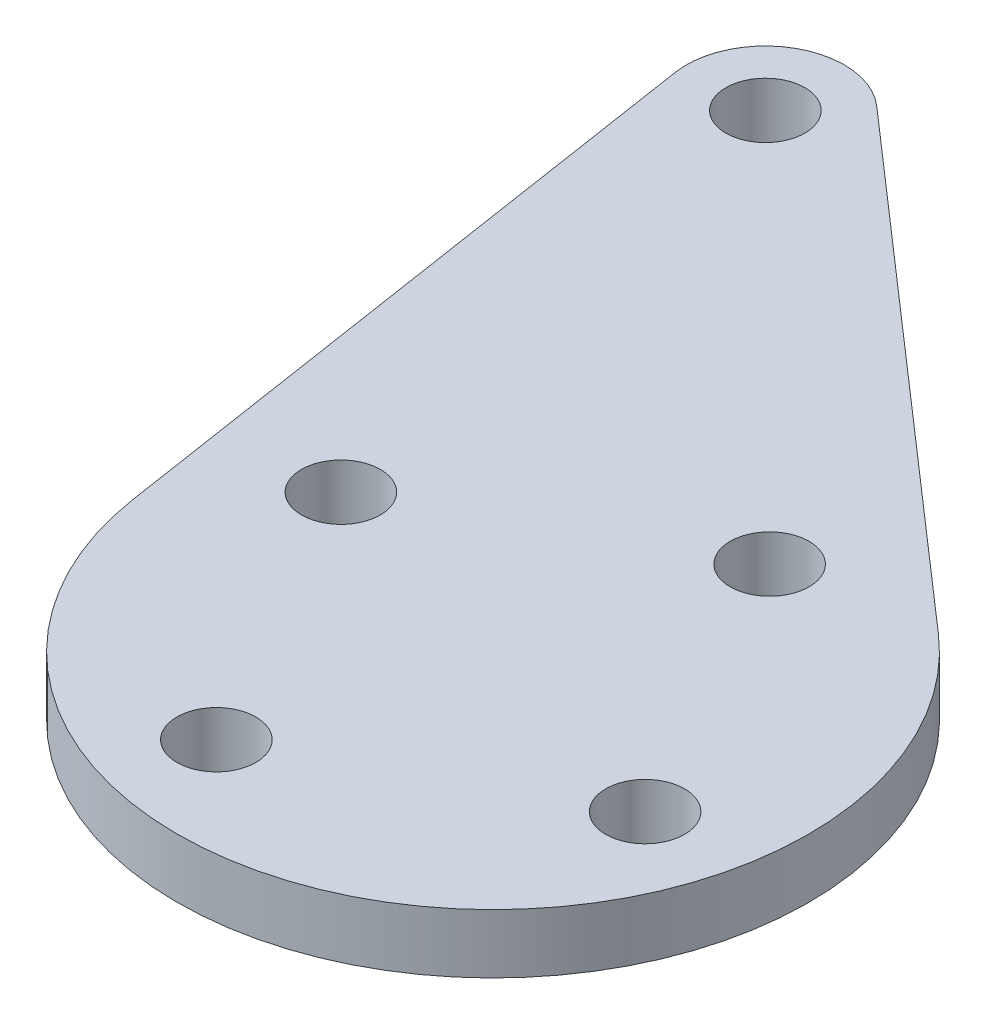
ISO-10303-21;
HEADER;
FILE_DESCRIPTION(('STEP AP214'),'2;1');
FILE_NAME('part.step','',(''),(''),'','','');
FILE_SCHEMA(('AUTOMOTIVE_DESIGN { 1 0 10303 214 1 1 1 1 }'));
ENDSEC;
DATA;
#1=APPLICATION_CONTEXT('core data for automotive mechanical design processes');
#2=APPLICATION_PROTOCOL_DEFINITION('international standard','automotive_design',2000,#1);
#3=PRODUCT_CONTEXT('',#1,'mechanical');
#4=PRODUCT('Part','Part','',(#3));
#5=PRODUCT_RELATED_PRODUCT_CATEGORY('part','',(#4));
#6=PRODUCT_DEFINITION_FORMATION('','',#4);
#7=PRODUCT_DEFINITION_CONTEXT('part definition',#1,'design');
#8=PRODUCT_DEFINITION('design','',#6,#7);
#9=PRODUCT_DEFINITION_SHAPE('','',#8);
#10=(LENGTH_UNIT() NAMED_UNIT(*) SI_UNIT(.MILLI.,.METRE.));
#11=(NAMED_UNIT(*) PLANE_ANGLE_UNIT() SI_UNIT($,.RADIAN.));
#12=(NAMED_UNIT(*) SI_UNIT($,.STERADIAN.) SOLID_ANGLE_UNIT());
#13=UNCERTAINTY_MEASURE_WITH_UNIT(LENGTH_MEASURE(1.E-05),#10,'distance_accuracy_value','');
#14=(GEOMETRIC_REPRESENTATION_CONTEXT(3) GLOBAL_UNCERTAINTY_ASSIGNED_CONTEXT((#13)) GLOBAL_UNIT_ASSIGNED_CONTEXT((#10,
#11,#12)) REPRESENTATION_CONTEXT('',''));
#15=CARTESIAN_POINT('',(0.,0.,0.));
#16=DIRECTION('',(0.,0.,1.));
#17=DIRECTION('',(1.,0.,0.));
#18=AXIS2_PLACEMENT_3D('',#15,#16,#17);
#19=CARTESIAN_POINT('',(101.135401666598,3.,-118.690728276876));
#20=DIRECTION('',(0.,1.,0.));
#21=DIRECTION('',(0.,0.,1.));
#22=AXIS2_PLACEMENT_3D('',#19,#20,#21);
#23=PLANE('',#22);
#24=CARTESIAN_POINT('',(97.9804315532696,3.,-107.825823142269));
#25=DIRECTION('',(0.,1.,0.));
#26=DIRECTION('',(0.,0.,1.));
#27=AXIS2_PLACEMENT_3D('',#24,#25,#26);
#28=CIRCLE('',#27,2.);
#29=CARTESIAN_POINT('',(97.9804315532696,3.,-105.825823142269));
#30=VERTEX_POINT('',#29);
#31=EDGE_CURVE('E133',#30,#30,#28,.T.);
#32=ORIENTED_EDGE('',*,*,#31,.F.);
#33=EDGE_LOOP('',(#32));
#34=FACE_BOUND('',#33,.T.);
#35=CARTESIAN_POINT('',(84.2699188075495,3.,-149.359205381734));
#36=DIRECTION('',(0.,1.,0.));
#37=DIRECTION('',(0.,0.,1.));
#38=AXIS2_PLACEMENT_3D('',#35,#36,#37);
#39=CIRCLE('',#38,2.);
#40=CARTESIAN_POINT('',(84.2699188075495,3.,-147.359205381734));
#41=VERTEX_POINT('',#40);
#42=EDGE_CURVE('E121',#41,#41,#39,.T.);
#43=ORIENTED_EDGE('',*,*,#42,.F.);
#44=EDGE_LOOP('',(#43));
#45=FACE_BOUND('',#44,.T.);
#46=CARTESIAN_POINT('',(101.135401666598,3.,-118.690728276876));
#47=DIRECTION('',(0.,1.,0.));
#48=DIRECTION('',(0.,0.,1.));
#49=AXIS2_PLACEMENT_3D('',#46,#47,#48);
#50=CIRCLE('',#49,16.);
#51=CARTESIAN_POINT('',(85.3218990347946,3.,-116.254925634223));
#52=VERTEX_POINT('',#51);
#53=CARTESIAN_POINT('',(111.662091712381,3.,-130.740159660971));
#54=VERTEX_POINT('',#53);
#55=EDGE_CURVE('E91',#52,#54,#50,.T.);
#56=ORIENTED_EDGE('',*,*,#55,.T.);
#57=DIRECTION('',(-0.753089461505936,0.,-0.657918127861438));
#58=VECTOR('',#57,1.);
#59=CARTESIAN_POINT('',(111.662091712381,3.,-130.740159660971));
#60=LINE('',#59,#58);
#61=CARTESIAN_POINT('',(86.9015913189954,3.,-152.371563227757));
#62=VERTEX_POINT('',#61);
#63=EDGE_CURVE('E86',#54,#62,#60,.T.);
#64=ORIENTED_EDGE('',*,*,#63,.T.);
#65=CARTESIAN_POINT('',(84.2699188075495,3.,-149.359205381734));
#66=DIRECTION('',(0.,1.,0.));
#67=DIRECTION('',(0.,0.,1.));
#68=AXIS2_PLACEMENT_3D('',#65,#66,#67);
#69=CIRCLE('',#68,3.99999999999998);
#70=CARTESIAN_POINT('',(80.3165431495987,3.,-148.75025472107));
#71=VERTEX_POINT('',#70);
#72=EDGE_CURVE('E89',#62,#71,#69,.T.);
#73=ORIENTED_EDGE('',*,*,#72,.T.);
#74=DIRECTION('',(0.152237665165874,0.,0.988343914487687));
#75=VECTOR('',#74,1.);
#76=CARTESIAN_POINT('',(85.3218990347946,3.,-116.254925634223));
#77=LINE('',#76,#75);
#78=EDGE_CURVE('E56',#71,#52,#77,.T.);
#79=ORIENTED_EDGE('',*,*,#78,.T.);
#80=EDGE_LOOP('',(#56,#64,#73,#79));
#81=FACE_BOUND('',#80,.T.);
#82=CARTESIAN_POINT('',(104.290371779926,3.,-129.555633411483));
#83=DIRECTION('',(0.,1.,0.));
#84=DIRECTION('',(0.,0.,1.));
#85=AXIS2_PLACEMENT_3D('',#82,#83,#84);
#86=CIRCLE('',#85,2.);
#87=CARTESIAN_POINT('',(104.290371779926,3.,-127.555633411483));
#88=VERTEX_POINT('',#87);
#89=EDGE_CURVE('E106',#88,#88,#86,.T.);
#90=ORIENTED_EDGE('',*,*,#89,.F.);
#91=EDGE_LOOP('',(#90));
#92=FACE_BOUND('',#91,.T.);
#93=CARTESIAN_POINT('',(112.000306801205,3.,-115.535758163548));
#94=DIRECTION('',(0.,1.,0.));
#95=DIRECTION('',(0.,0.,1.));
#96=AXIS2_PLACEMENT_3D('',#93,#94,#95);
#97=CIRCLE('',#96,2.);
#98=CARTESIAN_POINT('',(112.000306801205,3.,-113.535758163548));
#99=VERTEX_POINT('',#98);
#100=EDGE_CURVE('E127',#99,#99,#97,.T.);
#101=ORIENTED_EDGE('',*,*,#100,.F.);
#102=EDGE_LOOP('',(#101));
#103=FACE_BOUND('',#102,.T.);
#104=CARTESIAN_POINT('',(90.2704965319906,3.,-121.845698390204));
#105=DIRECTION('',(0.,1.,0.));
#106=DIRECTION('',(0.,0.,1.));
#107=AXIS2_PLACEMENT_3D('',#104,#105,#106);
#108=CIRCLE('',#107,2.);
#109=CARTESIAN_POINT('',(90.2704965319906,3.,-119.845698390204));
#110=VERTEX_POINT('',#109);
#111=EDGE_CURVE('E139',#110,#110,#108,.T.);
#112=ORIENTED_EDGE('',*,*,#111,.F.);
#113=EDGE_LOOP('',(#112));
#114=FACE_BOUND('',#113,.T.);
#115=ADVANCED_FACE('F39',(#34,#45,#81,#92,#103,#114),#23,.T.);
#116=CARTESIAN_POINT('',(101.135401666598,0.,-118.690728276876));
#117=DIRECTION('',(0.,1.,0.));
#118=DIRECTION('',(0.,0.,1.));
#119=AXIS2_PLACEMENT_3D('',#116,#117,#118);
#120=PLANE('',#119);
#121=CARTESIAN_POINT('',(101.135401666598,0.,-118.690728276876));
#122=DIRECTION('',(0.,1.,0.));
#123=DIRECTION('',(0.,0.,1.));
#124=AXIS2_PLACEMENT_3D('',#121,#122,#123);
#125=CIRCLE('',#124,16.);
#126=CARTESIAN_POINT('',(85.3218990347946,0.,-116.254925634223));
#127=VERTEX_POINT('',#126);
#128=CARTESIAN_POINT('',(111.662091712381,0.,-130.740159660971));
#129=VERTEX_POINT('',#128);
#130=EDGE_CURVE('E103',#127,#129,#125,.T.);
#131=ORIENTED_EDGE('',*,*,#130,.F.);
#132=DIRECTION('',(0.152237665165874,0.,0.988343914487687));
#133=VECTOR('',#132,1.);
#134=CARTESIAN_POINT('',(85.3218990347946,0.,-116.254925634223));
#135=LINE('',#134,#133);
#136=CARTESIAN_POINT('',(80.3165431495987,0.,-148.75025472107));
#137=VERTEX_POINT('',#136);
#138=EDGE_CURVE('E79',#137,#127,#135,.T.);
#139=ORIENTED_EDGE('',*,*,#138,.F.);
#140=CARTESIAN_POINT('',(84.2699188075495,0.,-149.359205381734));
#141=DIRECTION('',(0.,1.,0.));
#142=DIRECTION('',(0.,0.,1.));
#143=AXIS2_PLACEMENT_3D('',#140,#141,#142);
#144=CIRCLE('',#143,3.99999999999998);
#145=CARTESIAN_POINT('',(86.9015913189954,0.,-152.371563227757));
#146=VERTEX_POINT('',#145);
#147=EDGE_CURVE('E73',#146,#137,#144,.T.);
#148=ORIENTED_EDGE('',*,*,#147,.F.);
#149=DIRECTION('',(-0.753089461505936,0.,-0.657918127861438));
#150=VECTOR('',#149,1.);
#151=CARTESIAN_POINT('',(111.662091712381,0.,-130.740159660971));
#152=LINE('',#151,#150);
#153=EDGE_CURVE('E95',#129,#146,#152,.T.);
#154=ORIENTED_EDGE('',*,*,#153,.F.);
#155=EDGE_LOOP('',(#131,#139,#148,#154));
#156=FACE_BOUND('',#155,.T.);
#157=CARTESIAN_POINT('',(104.290371779926,0.,-129.555633411483));
#158=DIRECTION('',(0.,1.,0.));
#159=DIRECTION('',(0.,0.,1.));
#160=AXIS2_PLACEMENT_3D('',#157,#158,#159);
#161=CIRCLE('',#160,2.);
#162=CARTESIAN_POINT('',(104.290371779926,0.,-127.555633411483));
#163=VERTEX_POINT('',#162);
#164=EDGE_CURVE('E118',#163,#163,#161,.T.);
#165=ORIENTED_EDGE('',*,*,#164,.T.);
#166=EDGE_LOOP('',(#165));
#167=FACE_BOUND('',#166,.T.);
#168=CARTESIAN_POINT('',(84.2699188075495,0.,-149.359205381734));
#169=DIRECTION('',(0.,1.,0.));
#170=DIRECTION('',(0.,0.,1.));
#171=AXIS2_PLACEMENT_3D('',#168,#169,#170);
#172=CIRCLE('',#171,2.);
#173=CARTESIAN_POINT('',(84.2699188075495,0.,-147.359205381734));
#174=VERTEX_POINT('',#173);
#175=EDGE_CURVE('E124',#174,#174,#172,.T.);
#176=ORIENTED_EDGE('',*,*,#175,.T.);
#177=EDGE_LOOP('',(#176));
#178=FACE_BOUND('',#177,.T.);
#179=CARTESIAN_POINT('',(112.000306801205,0.,-115.535758163548));
#180=DIRECTION('',(0.,1.,0.));
#181=DIRECTION('',(0.,0.,1.));
#182=AXIS2_PLACEMENT_3D('',#179,#180,#181);
#183=CIRCLE('',#182,2.);
#184=CARTESIAN_POINT('',(112.000306801205,0.,-113.535758163548));
#185=VERTEX_POINT('',#184);
#186=EDGE_CURVE('E130',#185,#185,#183,.T.);
#187=ORIENTED_EDGE('',*,*,#186,.T.);
#188=EDGE_LOOP('',(#187));
#189=FACE_BOUND('',#188,.T.);
#190=CARTESIAN_POINT('',(97.9804315532696,0.,-107.825823142269));
#191=DIRECTION('',(0.,1.,0.));
#192=DIRECTION('',(0.,0.,1.));
#193=AXIS2_PLACEMENT_3D('',#190,#191,#192);
#194=CIRCLE('',#193,2.);
#195=CARTESIAN_POINT('',(97.9804315532696,0.,-105.825823142269));
#196=VERTEX_POINT('',#195);
#197=EDGE_CURVE('E136',#196,#196,#194,.T.);
#198=ORIENTED_EDGE('',*,*,#197,.T.);
#199=EDGE_LOOP('',(#198));
#200=FACE_BOUND('',#199,.T.);
#201=CARTESIAN_POINT('',(90.2704965319906,0.,-121.845698390204));
#202=DIRECTION('',(0.,1.,0.));
#203=DIRECTION('',(0.,0.,1.));
#204=AXIS2_PLACEMENT_3D('',#201,#202,#203);
#205=CIRCLE('',#204,2.);
#206=CARTESIAN_POINT('',(90.2704965319906,0.,-119.845698390204));
#207=VERTEX_POINT('',#206);
#208=EDGE_CURVE('E142',#207,#207,#205,.T.);
#209=ORIENTED_EDGE('',*,*,#208,.T.);
#210=EDGE_LOOP('',(#209));
#211=FACE_BOUND('',#210,.T.);
#212=ADVANCED_FACE('F114',(#156,#167,#178,#189,#200,#211),#120,.F.);
#213=CARTESIAN_POINT('',(101.135401666598,3.,-118.690728276876));
#214=DIRECTION('',(0.,-1.,0.));
#215=DIRECTION('',(0.,0.,-1.));
#216=AXIS2_PLACEMENT_3D('',#213,#214,#215);
#217=CYLINDRICAL_SURFACE('',#216,16.);
#218=ORIENTED_EDGE('',*,*,#130,.T.);
#219=DIRECTION('',(0.,-1.,0.));
#220=VECTOR('',#219,1.);
#221=CARTESIAN_POINT('',(111.662091712381,3.,-130.740159660971));
#222=LINE('',#221,#220);
#223=EDGE_CURVE('E11',#54,#129,#222,.T.);
#224=ORIENTED_EDGE('',*,*,#223,.F.);
#225=ORIENTED_EDGE('',*,*,#55,.F.);
#226=DIRECTION('',(0.,-1.,0.));
#227=VECTOR('',#226,1.);
#228=CARTESIAN_POINT('',(85.3218990347946,3.,-116.254925634223));
#229=LINE('',#228,#227);
#230=EDGE_CURVE('E99',#52,#127,#229,.T.);
#231=ORIENTED_EDGE('',*,*,#230,.T.);
#232=EDGE_LOOP('',(#218,#224,#225,#231));
#233=FACE_BOUND('',#232,.T.);
#234=ADVANCED_FACE('F41',(#233),#217,.T.);
#235=CARTESIAN_POINT('',(111.662091712381,3.,-130.740159660971));
#236=DIRECTION('',(-0.657918127861438,0.,0.753089461505936));
#237=DIRECTION('',(0.753089461505936,0.,0.657918127861438));
#238=AXIS2_PLACEMENT_3D('',#235,#236,#237);
#239=PLANE('',#238);
#240=ORIENTED_EDGE('',*,*,#153,.T.);
#241=DIRECTION('',(0.,-1.,0.));
#242=VECTOR('',#241,1.);
#243=CARTESIAN_POINT('',(86.9015913189954,3.,-152.371563227757));
#244=LINE('',#243,#242);
#245=EDGE_CURVE('E48',#62,#146,#244,.T.);
#246=ORIENTED_EDGE('',*,*,#245,.F.);
#247=ORIENTED_EDGE('',*,*,#63,.F.);
#248=ORIENTED_EDGE('',*,*,#223,.T.);
#249=EDGE_LOOP('',(#240,#246,#247,#248));
#250=FACE_BOUND('',#249,.T.);
#251=ADVANCED_FACE('F94',(#250),#239,.F.);
#252=CARTESIAN_POINT('',(84.2699188075495,3.,-149.359205381734));
#253=DIRECTION('',(0.,-1.,0.));
#254=DIRECTION('',(0.,0.,-1.));
#255=AXIS2_PLACEMENT_3D('',#252,#253,#254);
#256=CYLINDRICAL_SURFACE('',#255,3.99999999999998);
#257=ORIENTED_EDGE('',*,*,#147,.T.);
#258=DIRECTION('',(0.,-1.,0.));
#259=VECTOR('',#258,1.);
#260=CARTESIAN_POINT('',(80.3165431495987,3.,-148.75025472107));
#261=LINE('',#260,#259);
#262=EDGE_CURVE('E96',#71,#137,#261,.T.);
#263=ORIENTED_EDGE('',*,*,#262,.F.);
#264=ORIENTED_EDGE('',*,*,#72,.F.);
#265=ORIENTED_EDGE('',*,*,#245,.T.);
#266=EDGE_LOOP('',(#257,#263,#264,#265));
#267=FACE_BOUND('',#266,.T.);
#268=ADVANCED_FACE('F97',(#267),#256,.T.);
#269=CARTESIAN_POINT('',(85.3218990347946,3.,-116.254925634223));
#270=DIRECTION('',(0.988343914487686,0.,-0.152237665165874));
#271=DIRECTION('',(-0.152237665165874,0.,-0.988343914487687));
#272=AXIS2_PLACEMENT_3D('',#269,#270,#271);
#273=PLANE('',#272);
#274=ORIENTED_EDGE('',*,*,#138,.T.);
#275=ORIENTED_EDGE('',*,*,#230,.F.);
#276=ORIENTED_EDGE('',*,*,#78,.F.);
#277=ORIENTED_EDGE('',*,*,#262,.T.);
#278=EDGE_LOOP('',(#274,#275,#276,#277));
#279=FACE_BOUND('',#278,.T.);
#280=ADVANCED_FACE('F111',(#279),#273,.F.);
#281=CARTESIAN_POINT('',(104.290371779926,3.,-129.555633411483));
#282=DIRECTION('',(0.,-1.,0.));
#283=DIRECTION('',(0.,0.,-1.));
#284=AXIS2_PLACEMENT_3D('',#281,#282,#283);
#285=CYLINDRICAL_SURFACE('',#284,2.);
#286=ORIENTED_EDGE('',*,*,#89,.T.);
#287=EDGE_LOOP('',(#286));
#288=FACE_BOUND('',#287,.T.);
#289=ORIENTED_EDGE('',*,*,#164,.F.);
#290=EDGE_LOOP('',(#289));
#291=FACE_BOUND('',#290,.T.);
#292=ADVANCED_FACE('F161',(#288,#291),#285,.F.);
#293=CARTESIAN_POINT('',(84.2699188075495,3.,-149.359205381734));
#294=DIRECTION('',(0.,-1.,0.));
#295=DIRECTION('',(0.,0.,-1.));
#296=AXIS2_PLACEMENT_3D('',#293,#294,#295);
#297=CYLINDRICAL_SURFACE('',#296,2.);
#298=ORIENTED_EDGE('',*,*,#42,.T.);
#299=EDGE_LOOP('',(#298));
#300=FACE_BOUND('',#299,.T.);
#301=ORIENTED_EDGE('',*,*,#175,.F.);
#302=EDGE_LOOP('',(#301));
#303=FACE_BOUND('',#302,.T.);
#304=ADVANCED_FACE('F206',(#300,#303),#297,.F.);
#305=CARTESIAN_POINT('',(112.000306801205,3.,-115.535758163548));
#306=DIRECTION('',(0.,-1.,0.));
#307=DIRECTION('',(0.,0.,-1.));
#308=AXIS2_PLACEMENT_3D('',#305,#306,#307);
#309=CYLINDRICAL_SURFACE('',#308,2.);
#310=ORIENTED_EDGE('',*,*,#100,.T.);
#311=EDGE_LOOP('',(#310));
#312=FACE_BOUND('',#311,.T.);
#313=ORIENTED_EDGE('',*,*,#186,.F.);
#314=EDGE_LOOP('',(#313));
#315=FACE_BOUND('',#314,.T.);
#316=ADVANCED_FACE('F214',(#312,#315),#309,.F.);
#317=CARTESIAN_POINT('',(97.9804315532696,3.,-107.825823142269));
#318=DIRECTION('',(0.,-1.,0.));
#319=DIRECTION('',(0.,0.,-1.));
#320=AXIS2_PLACEMENT_3D('',#317,#318,#319);
#321=CYLINDRICAL_SURFACE('',#320,2.);
#322=ORIENTED_EDGE('',*,*,#31,.T.);
#323=EDGE_LOOP('',(#322));
#324=FACE_BOUND('',#323,.T.);
#325=ORIENTED_EDGE('',*,*,#197,.F.);
#326=EDGE_LOOP('',(#325));
#327=FACE_BOUND('',#326,.T.);
#328=ADVANCED_FACE('F222',(#324,#327),#321,.F.);
#329=CARTESIAN_POINT('',(90.2704965319906,3.,-121.845698390204));
#330=DIRECTION('',(0.,-1.,0.));
#331=DIRECTION('',(0.,0.,-1.));
#332=AXIS2_PLACEMENT_3D('',#329,#330,#331);
#333=CYLINDRICAL_SURFACE('',#332,2.);
#334=ORIENTED_EDGE('',*,*,#111,.T.);
#335=EDGE_LOOP('',(#334));
#336=FACE_BOUND('',#335,.T.);
#337=ORIENTED_EDGE('',*,*,#208,.F.);
#338=EDGE_LOOP('',(#337));
#339=FACE_BOUND('',#338,.T.);
#340=ADVANCED_FACE('F148',(#336,#339),#333,.F.);
#341=CLOSED_SHELL('',(#115,#212,#234,#251,#268,#280,#292,#304,#316,#328,#340));
#342=MANIFOLD_SOLID_BREP('B2',#341);
#343=ADVANCED_BREP_SHAPE_REPRESENTATION('',(#18,#342),#14);
#344=SHAPE_DEFINITION_REPRESENTATION(#9,#343);
ENDSEC;
END-ISO-10303-21;
